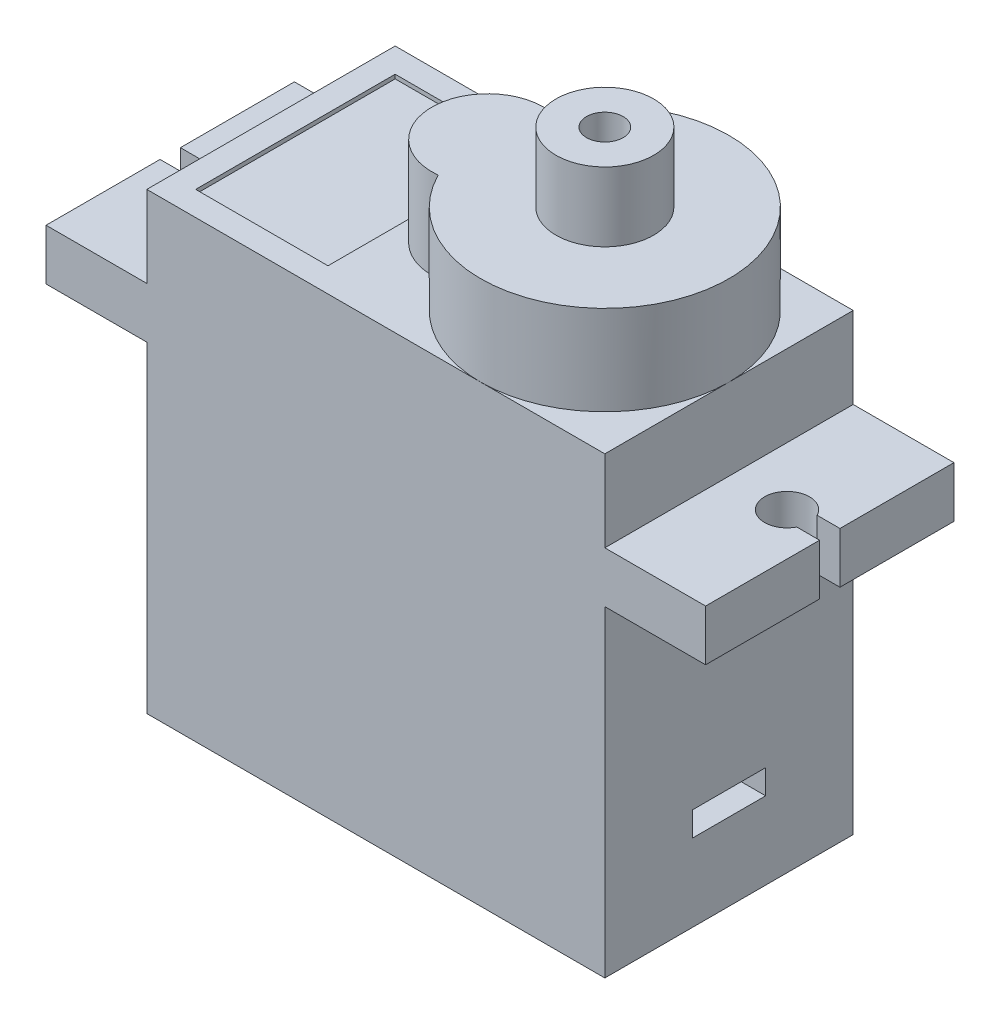
ISO-10303-21;
HEADER;
FILE_DESCRIPTION(('STEP AP214'),'2;1');
FILE_NAME('part.step','',(''),(''),'','','');
FILE_SCHEMA(('AUTOMOTIVE_DESIGN { 1 0 10303 214 1 1 1 1 }'));
ENDSEC;
DATA;
#1=APPLICATION_CONTEXT('core data for automotive mechanical design processes');
#2=APPLICATION_PROTOCOL_DEFINITION('international standard','automotive_design',2000,#1);
#3=PRODUCT_CONTEXT('',#1,'mechanical');
#4=PRODUCT('Part','Part','',(#3));
#5=PRODUCT_RELATED_PRODUCT_CATEGORY('part','',(#4));
#6=PRODUCT_DEFINITION_FORMATION('','',#4);
#7=PRODUCT_DEFINITION_CONTEXT('part definition',#1,'design');
#8=PRODUCT_DEFINITION('design','',#6,#7);
#9=PRODUCT_DEFINITION_SHAPE('','',#8);
#10=(LENGTH_UNIT() NAMED_UNIT(*) SI_UNIT(.MILLI.,.METRE.));
#11=(NAMED_UNIT(*) PLANE_ANGLE_UNIT() SI_UNIT($,.RADIAN.));
#12=(NAMED_UNIT(*) SI_UNIT($,.STERADIAN.) SOLID_ANGLE_UNIT());
#13=UNCERTAINTY_MEASURE_WITH_UNIT(LENGTH_MEASURE(1.E-05),#10,'distance_accuracy_value','');
#14=(GEOMETRIC_REPRESENTATION_CONTEXT(3) GLOBAL_UNCERTAINTY_ASSIGNED_CONTEXT((#13)) GLOBAL_UNIT_ASSIGNED_CONTEXT((#10,
#11,#12)) REPRESENTATION_CONTEXT('',''));
#15=CARTESIAN_POINT('',(0.,0.,0.));
#16=DIRECTION('',(0.,0.,1.));
#17=DIRECTION('',(1.,0.,0.));
#18=AXIS2_PLACEMENT_3D('',#15,#16,#17);
#19=CARTESIAN_POINT('',(16.2,15.8,12.2));
#20=DIRECTION('',(-1.,0.,0.));
#21=DIRECTION('',(0.,-1.,0.));
#22=AXIS2_PLACEMENT_3D('',#19,#20,#21);
#23=PLANE('',#22);
#24=DIRECTION('',(0.,1.,0.));
#25=VECTOR('',#24,1.);
#26=CARTESIAN_POINT('',(16.2,-0.00100000000002182,5.6));
#27=LINE('',#26,#25);
#28=CARTESIAN_POINT('',(16.2,15.8,5.6));
#29=VERTEX_POINT('',#28);
#30=CARTESIAN_POINT('',(16.2,18.3,5.6));
#31=VERTEX_POINT('',#30);
#32=EDGE_CURVE('E306',#29,#31,#27,.T.);
#33=ORIENTED_EDGE('',*,*,#32,.F.);
#34=DIRECTION('',(0.,0.,-1.));
#35=VECTOR('',#34,1.);
#36=CARTESIAN_POINT('',(16.2,15.8,12.2));
#37=LINE('',#36,#35);
#38=CARTESIAN_POINT('',(16.2,15.8,0.));
#39=VERTEX_POINT('',#38);
#40=EDGE_CURVE('E509',#29,#39,#37,.T.);
#41=ORIENTED_EDGE('',*,*,#40,.T.);
#42=DIRECTION('',(0.,1.,0.));
#43=VECTOR('',#42,1.);
#44=CARTESIAN_POINT('',(16.2,15.8,0.));
#45=LINE('',#44,#43);
#46=CARTESIAN_POINT('',(16.2,18.3,0.));
#47=VERTEX_POINT('',#46);
#48=EDGE_CURVE('E463',#39,#47,#45,.T.);
#49=ORIENTED_EDGE('',*,*,#48,.T.);
#50=DIRECTION('',(0.,0.,-1.));
#51=VECTOR('',#50,1.);
#52=CARTESIAN_POINT('',(16.2,18.3,12.2));
#53=LINE('',#52,#51);
#54=EDGE_CURVE('E507',#31,#47,#53,.T.);
#55=ORIENTED_EDGE('',*,*,#54,.F.);
#56=EDGE_LOOP('',(#33,#41,#49,#55));
#57=FACE_BOUND('',#56,.T.);
#58=ADVANCED_FACE('F68',(#57),#23,.F.);
#59=CARTESIAN_POINT('',(-11.25,18.3,12.2));
#60=DIRECTION('',(0.,-1.,0.));
#61=DIRECTION('',(1.,0.,0.));
#62=AXIS2_PLACEMENT_3D('',#59,#60,#61);
#63=PLANE('',#62);
#64=DIRECTION('',(-1.,0.,0.));
#65=VECTOR('',#64,1.);
#66=CARTESIAN_POINT('',(0.,18.3,6.6));
#67=LINE('',#66,#65);
#68=CARTESIAN_POINT('',(-15.0797958971133,18.3,6.6));
#69=VERTEX_POINT('',#68);
#70=CARTESIAN_POINT('',(-16.2,18.3,6.6));
#71=VERTEX_POINT('',#70);
#72=EDGE_CURVE('E317',#69,#71,#67,.T.);
#73=ORIENTED_EDGE('',*,*,#72,.T.);
#74=DIRECTION('',(0.,0.,-1.));
#75=VECTOR('',#74,1.);
#76=CARTESIAN_POINT('',(-16.2,18.3,12.2));
#77=LINE('',#76,#75);
#78=CARTESIAN_POINT('',(-16.2,18.3,12.2));
#79=VERTEX_POINT('',#78);
#80=EDGE_CURVE('E491',#79,#71,#77,.T.);
#81=ORIENTED_EDGE('',*,*,#80,.F.);
#82=DIRECTION('',(-1.,0.,0.));
#83=VECTOR('',#82,1.);
#84=CARTESIAN_POINT('',(-11.25,18.3,12.2));
#85=LINE('',#84,#83);
#86=CARTESIAN_POINT('',(-11.25,18.3,12.2));
#87=VERTEX_POINT('',#86);
#88=EDGE_CURVE('E447',#87,#79,#85,.T.);
#89=ORIENTED_EDGE('',*,*,#88,.F.);
#90=DIRECTION('',(0.,0.,-1.));
#91=VECTOR('',#90,1.);
#92=CARTESIAN_POINT('',(-11.25,18.3,12.2));
#93=LINE('',#92,#91);
#94=CARTESIAN_POINT('',(-11.25,18.3,0.));
#95=VERTEX_POINT('',#94);
#96=EDGE_CURVE('E494',#87,#95,#93,.T.);
#97=ORIENTED_EDGE('',*,*,#96,.T.);
#98=DIRECTION('',(-1.,0.,0.));
#99=VECTOR('',#98,1.);
#100=CARTESIAN_POINT('',(-11.25,18.3,0.));
#101=LINE('',#100,#99);
#102=CARTESIAN_POINT('',(-16.2,18.3,0.));
#103=VERTEX_POINT('',#102);
#104=EDGE_CURVE('E477',#95,#103,#101,.T.);
#105=ORIENTED_EDGE('',*,*,#104,.T.);
#106=CARTESIAN_POINT('',(-16.2,18.3,5.6));
#107=VERTEX_POINT('',#106);
#108=EDGE_CURVE('E490',#107,#103,#77,.T.);
#109=ORIENTED_EDGE('',*,*,#108,.F.);
#110=DIRECTION('',(-1.,0.,0.));
#111=VECTOR('',#110,1.);
#112=CARTESIAN_POINT('',(0.,18.3,5.60000000000001));
#113=LINE('',#112,#111);
#114=CARTESIAN_POINT('',(-15.0797958971133,18.3,5.6));
#115=VERTEX_POINT('',#114);
#116=EDGE_CURVE('E314',#115,#107,#113,.T.);
#117=ORIENTED_EDGE('',*,*,#116,.F.);
#118=CARTESIAN_POINT('',(-14.1,18.3,6.1));
#119=DIRECTION('',(0.,1.,0.));
#120=DIRECTION('',(-1.,0.,0.));
#121=AXIS2_PLACEMENT_3D('',#118,#119,#120);
#122=CIRCLE('',#121,1.1);
#123=EDGE_CURVE('E310',#69,#115,#122,.T.);
#124=ORIENTED_EDGE('',*,*,#123,.F.);
#125=EDGE_LOOP('',(#73,#81,#89,#97,#105,#109,#117,#124));
#126=FACE_BOUND('',#125,.T.);
#127=ADVANCED_FACE('F565',(#126),#63,.F.);
#128=CARTESIAN_POINT('',(-16.2,18.3,12.2));
#129=DIRECTION('',(1.,0.,0.));
#130=DIRECTION('',(0.,0.,-1.));
#131=AXIS2_PLACEMENT_3D('',#128,#129,#130);
#132=PLANE('',#131);
#133=DIRECTION('',(0.,1.,0.));
#134=VECTOR('',#133,1.);
#135=CARTESIAN_POINT('',(-16.2,-0.00100000000002182,6.6));
#136=LINE('',#135,#134);
#137=CARTESIAN_POINT('',(-16.2,15.8,6.6));
#138=VERTEX_POINT('',#137);
#139=EDGE_CURVE('E323',#138,#71,#136,.T.);
#140=ORIENTED_EDGE('',*,*,#139,.F.);
#141=DIRECTION('',(0.,0.,-1.));
#142=VECTOR('',#141,1.);
#143=CARTESIAN_POINT('',(-16.2,15.8,12.2));
#144=LINE('',#143,#142);
#145=CARTESIAN_POINT('',(-16.2,15.8,12.2));
#146=VERTEX_POINT('',#145);
#147=EDGE_CURVE('E487',#146,#138,#144,.T.);
#148=ORIENTED_EDGE('',*,*,#147,.F.);
#149=DIRECTION('',(0.,-1.,0.));
#150=VECTOR('',#149,1.);
#151=CARTESIAN_POINT('',(-16.2,18.3,12.2));
#152=LINE('',#151,#150);
#153=EDGE_CURVE('E449',#79,#146,#152,.T.);
#154=ORIENTED_EDGE('',*,*,#153,.F.);
#155=ORIENTED_EDGE('',*,*,#80,.T.);
#156=EDGE_LOOP('',(#140,#148,#154,#155));
#157=FACE_BOUND('',#156,.T.);
#158=ADVANCED_FACE('F570',(#157),#132,.F.);
#159=CARTESIAN_POINT('',(-16.2,15.8,12.2));
#160=DIRECTION('',(0.,1.,0.));
#161=DIRECTION('',(0.,0.,1.));
#162=AXIS2_PLACEMENT_3D('',#159,#160,#161);
#163=PLANE('',#162);
#164=DIRECTION('',(1.,0.,0.));
#165=VECTOR('',#164,1.);
#166=CARTESIAN_POINT('',(0.,15.8,6.6));
#167=LINE('',#166,#165);
#168=CARTESIAN_POINT('',(-15.0797958971133,15.8,6.6));
#169=VERTEX_POINT('',#168);
#170=EDGE_CURVE('E311',#138,#169,#167,.T.);
#171=ORIENTED_EDGE('',*,*,#170,.T.);
#172=CARTESIAN_POINT('',(-14.1,15.8,6.1));
#173=DIRECTION('',(0.,1.,0.));
#174=DIRECTION('',(0.,0.,1.));
#175=AXIS2_PLACEMENT_3D('',#172,#173,#174);
#176=CIRCLE('',#175,1.1);
#177=CARTESIAN_POINT('',(-15.0797958971133,15.8,5.59999999999999));
#178=VERTEX_POINT('',#177);
#179=EDGE_CURVE('E315',#178,#169,#176,.F.);
#180=ORIENTED_EDGE('',*,*,#179,.F.);
#181=DIRECTION('',(1.,0.,0.));
#182=VECTOR('',#181,1.);
#183=CARTESIAN_POINT('',(0.,15.8,5.60000000000001));
#184=LINE('',#183,#182);
#185=CARTESIAN_POINT('',(-16.2,15.8,5.6));
#186=VERTEX_POINT('',#185);
#187=EDGE_CURVE('E91',#186,#178,#184,.T.);
#188=ORIENTED_EDGE('',*,*,#187,.F.);
#189=CARTESIAN_POINT('',(-16.2,15.8,0.));
#190=VERTEX_POINT('',#189);
#191=EDGE_CURVE('E486',#186,#190,#144,.T.);
#192=ORIENTED_EDGE('',*,*,#191,.T.);
#193=DIRECTION('',(1.,0.,0.));
#194=VECTOR('',#193,1.);
#195=CARTESIAN_POINT('',(-16.2,15.8,0.));
#196=LINE('',#195,#194);
#197=CARTESIAN_POINT('',(-11.25,15.8,0.));
#198=VERTEX_POINT('',#197);
#199=EDGE_CURVE('E429',#190,#198,#196,.T.);
#200=ORIENTED_EDGE('',*,*,#199,.T.);
#201=DIRECTION('',(0.,0.,-1.));
#202=VECTOR('',#201,1.);
#203=CARTESIAN_POINT('',(-11.25,15.8,12.2));
#204=LINE('',#203,#202);
#205=CARTESIAN_POINT('',(-11.25,15.8,12.2));
#206=VERTEX_POINT('',#205);
#207=EDGE_CURVE('E453',#206,#198,#204,.T.);
#208=ORIENTED_EDGE('',*,*,#207,.F.);
#209=DIRECTION('',(1.,0.,0.));
#210=VECTOR('',#209,1.);
#211=CARTESIAN_POINT('',(-16.2,15.8,12.2));
#212=LINE('',#211,#210);
#213=EDGE_CURVE('E451',#146,#206,#212,.T.);
#214=ORIENTED_EDGE('',*,*,#213,.F.);
#215=ORIENTED_EDGE('',*,*,#147,.T.);
#216=EDGE_LOOP('',(#171,#180,#188,#192,#200,#208,#214,#215));
#217=FACE_BOUND('',#216,.T.);
#218=ADVANCED_FACE('F574',(#217),#163,.F.);
#219=CARTESIAN_POINT('',(11.25,22.3,12.2));
#220=DIRECTION('',(0.,-1.,0.));
#221=DIRECTION('',(1.,0.,0.));
#222=AXIS2_PLACEMENT_3D('',#219,#220,#221);
#223=PLANE('',#222);
#224=CARTESIAN_POINT('',(-0.6,22.3,6.1));
#225=DIRECTION('',(0.,1.,0.));
#226=DIRECTION('',(-1.,0.,0.));
#227=AXIS2_PLACEMENT_3D('',#224,#225,#226);
#228=CIRCLE('',#227,2.75);
#229=CARTESIAN_POINT('',(-0.30304347826087,22.3,3.36608031862738));
#230=VERTEX_POINT('',#229);
#231=CARTESIAN_POINT('',(-0.30304347826087,22.3,8.83391968137262));
#232=VERTEX_POINT('',#231);
#233=EDGE_CURVE('E368',#230,#232,#228,.T.);
#234=ORIENTED_EDGE('',*,*,#233,.F.);
#235=CARTESIAN_POINT('',(5.15,22.3,6.1));
#236=DIRECTION('',(0.,1.,0.));
#237=DIRECTION('',(-1.,0.,0.));
#238=AXIS2_PLACEMENT_3D('',#235,#236,#237);
#239=CIRCLE('',#238,6.1);
#240=CARTESIAN_POINT('',(5.15,22.3,0.));
#241=VERTEX_POINT('',#240);
#242=EDGE_CURVE('E386',#241,#230,#239,.T.);
#243=ORIENTED_EDGE('',*,*,#242,.F.);
#244=DIRECTION('',(-1.,0.,0.));
#245=VECTOR('',#244,1.);
#246=CARTESIAN_POINT('',(11.25,22.3,0.));
#247=LINE('',#246,#245);
#248=CARTESIAN_POINT('',(-11.25,22.3,0.));
#249=VERTEX_POINT('',#248);
#250=EDGE_CURVE('E471',#241,#249,#247,.T.);
#251=ORIENTED_EDGE('',*,*,#250,.T.);
#252=DIRECTION('',(0.,0.,-1.));
#253=VECTOR('',#252,1.);
#254=CARTESIAN_POINT('',(-11.25,22.3,12.2));
#255=LINE('',#254,#253);
#256=CARTESIAN_POINT('',(-11.25,22.3,12.2));
#257=VERTEX_POINT('',#256);
#258=EDGE_CURVE('E497',#257,#249,#255,.T.);
#259=ORIENTED_EDGE('',*,*,#258,.F.);
#260=DIRECTION('',(-1.,0.,0.));
#261=VECTOR('',#260,1.);
#262=CARTESIAN_POINT('',(11.25,22.3,12.2));
#263=LINE('',#262,#261);
#264=CARTESIAN_POINT('',(5.15,22.3,12.2));
#265=VERTEX_POINT('',#264);
#266=EDGE_CURVE('E441',#265,#257,#263,.T.);
#267=ORIENTED_EDGE('',*,*,#266,.F.);
#268=EDGE_CURVE('E379',#232,#265,#239,.T.);
#269=ORIENTED_EDGE('',*,*,#268,.F.);
#270=EDGE_LOOP('',(#234,#243,#251,#259,#267,#269));
#271=FACE_BOUND('',#270,.T.);
#272=DIRECTION('',(0.,0.,1.));
#273=VECTOR('',#272,1.);
#274=CARTESIAN_POINT('',(-3.55,22.3,0.));
#275=LINE('',#274,#273);
#276=CARTESIAN_POINT('',(-3.55,22.3,1.2));
#277=VERTEX_POINT('',#276);
#278=CARTESIAN_POINT('',(-3.55,22.3,11.));
#279=VERTEX_POINT('',#278);
#280=EDGE_CURVE('E341',#277,#279,#275,.T.);
#281=ORIENTED_EDGE('',*,*,#280,.T.);
#282=DIRECTION('',(1.,0.,0.));
#283=VECTOR('',#282,1.);
#284=CARTESIAN_POINT('',(0.,22.3,11.));
#285=LINE('',#284,#283);
#286=CARTESIAN_POINT('',(-10.05,22.3,11.));
#287=VERTEX_POINT('',#286);
#288=EDGE_CURVE('E347',#287,#279,#285,.T.);
#289=ORIENTED_EDGE('',*,*,#288,.F.);
#290=DIRECTION('',(0.,0.,1.));
#291=VECTOR('',#290,1.);
#292=CARTESIAN_POINT('',(-10.05,22.3,0.));
#293=LINE('',#292,#291);
#294=CARTESIAN_POINT('',(-10.05,22.3,1.2));
#295=VERTEX_POINT('',#294);
#296=EDGE_CURVE('E361',#295,#287,#293,.T.);
#297=ORIENTED_EDGE('',*,*,#296,.F.);
#298=DIRECTION('',(1.,0.,0.));
#299=VECTOR('',#298,1.);
#300=CARTESIAN_POINT('',(0.,22.3,1.2));
#301=LINE('',#300,#299);
#302=EDGE_CURVE('E358',#295,#277,#301,.T.);
#303=ORIENTED_EDGE('',*,*,#302,.T.);
#304=EDGE_LOOP('',(#281,#289,#297,#303));
#305=FACE_BOUND('',#304,.T.);
#306=ADVANCED_FACE('F536',(#271,#305),#223,.F.);
#307=CARTESIAN_POINT('',(11.25,22.3,6.1));
#308=VERTEX_POINT('',#307);
#309=EDGE_CURVE('E76',#265,#308,#239,.T.);
#310=ORIENTED_EDGE('',*,*,#309,.F.);
#311=CARTESIAN_POINT('',(11.25,22.3,12.2));
#312=VERTEX_POINT('',#311);
#313=EDGE_CURVE('E442',#312,#265,#263,.T.);
#314=ORIENTED_EDGE('',*,*,#313,.F.);
#315=DIRECTION('',(0.,0.,-1.));
#316=VECTOR('',#315,1.);
#317=CARTESIAN_POINT('',(11.25,22.3,12.2));
#318=LINE('',#317,#316);
#319=EDGE_CURVE('E501',#312,#308,#318,.T.);
#320=ORIENTED_EDGE('',*,*,#319,.T.);
#321=EDGE_LOOP('',(#310,#314,#320));
#322=FACE_BOUND('',#321,.T.);
#323=ADVANCED_FACE('F532',(#322),#223,.F.);
#324=CARTESIAN_POINT('',(-11.25,15.8,12.2));
#325=DIRECTION('',(1.,0.,0.));
#326=DIRECTION('',(0.,1.,0.));
#327=AXIS2_PLACEMENT_3D('',#324,#325,#326);
#328=PLANE('',#327);
#329=DIRECTION('',(0.,-1.,0.));
#330=VECTOR('',#329,1.);
#331=CARTESIAN_POINT('',(-11.25,15.8,0.));
#332=LINE('',#331,#330);
#333=CARTESIAN_POINT('',(-11.25,0.,0.));
#334=VERTEX_POINT('',#333);
#335=EDGE_CURVE('E418',#198,#334,#332,.T.);
#336=ORIENTED_EDGE('',*,*,#335,.T.);
#337=DIRECTION('',(0.,0.,-1.));
#338=VECTOR('',#337,1.);
#339=CARTESIAN_POINT('',(-11.25,0.,12.2));
#340=LINE('',#339,#338);
#341=CARTESIAN_POINT('',(-11.25,0.,12.2));
#342=VERTEX_POINT('',#341);
#343=EDGE_CURVE('E518',#342,#334,#340,.T.);
#344=ORIENTED_EDGE('',*,*,#343,.F.);
#345=DIRECTION('',(0.,-1.,0.));
#346=VECTOR('',#345,1.);
#347=CARTESIAN_POINT('',(-11.25,15.8,12.2));
#348=LINE('',#347,#346);
#349=EDGE_CURVE('E425',#206,#342,#348,.T.);
#350=ORIENTED_EDGE('',*,*,#349,.F.);
#351=ORIENTED_EDGE('',*,*,#207,.T.);
#352=EDGE_LOOP('',(#336,#344,#350,#351));
#353=FACE_BOUND('',#352,.T.);
#354=ADVANCED_FACE('F70',(#353),#328,.F.);
#355=CARTESIAN_POINT('',(-11.25,0.,12.2));
#356=DIRECTION('',(0.,1.,0.));
#357=DIRECTION('',(-1.,0.,0.));
#358=AXIS2_PLACEMENT_3D('',#355,#356,#357);
#359=PLANE('',#358);
#360=DIRECTION('',(1.,0.,0.));
#361=VECTOR('',#360,1.);
#362=CARTESIAN_POINT('',(-11.25,0.,0.));
#363=LINE('',#362,#361);
#364=CARTESIAN_POINT('',(11.25,0.,0.));
#365=VERTEX_POINT('',#364);
#366=EDGE_CURVE('E456',#334,#365,#363,.T.);
#367=ORIENTED_EDGE('',*,*,#366,.T.);
#368=DIRECTION('',(0.,0.,-1.));
#369=VECTOR('',#368,1.);
#370=CARTESIAN_POINT('',(11.25,0.,12.2));
#371=LINE('',#370,#369);
#372=CARTESIAN_POINT('',(11.25,0.,12.2));
#373=VERTEX_POINT('',#372);
#374=EDGE_CURVE('E516',#373,#365,#371,.T.);
#375=ORIENTED_EDGE('',*,*,#374,.F.);
#376=DIRECTION('',(1.,0.,0.));
#377=VECTOR('',#376,1.);
#378=CARTESIAN_POINT('',(-11.25,0.,12.2));
#379=LINE('',#378,#377);
#380=EDGE_CURVE('E428',#342,#373,#379,.T.);
#381=ORIENTED_EDGE('',*,*,#380,.F.);
#382=ORIENTED_EDGE('',*,*,#343,.T.);
#383=EDGE_LOOP('',(#367,#375,#381,#382));
#384=FACE_BOUND('',#383,.T.);
#385=ADVANCED_FACE('F582',(#384),#359,.F.);
#386=CARTESIAN_POINT('',(11.25,0.,12.2));
#387=DIRECTION('',(-1.,0.,0.));
#388=DIRECTION('',(0.,-1.,0.));
#389=AXIS2_PLACEMENT_3D('',#386,#387,#388);
#390=PLANE('',#389);
#391=DIRECTION('',(0.,0.,-1.));
#392=VECTOR('',#391,1.);
#393=CARTESIAN_POINT('',(11.25,3.8,7.9));
#394=LINE('',#393,#392);
#395=CARTESIAN_POINT('',(11.25,3.8,7.9));
#396=VERTEX_POINT('',#395);
#397=CARTESIAN_POINT('',(11.25,3.8,4.3));
#398=VERTEX_POINT('',#397);
#399=EDGE_CURVE('E408',#396,#398,#394,.T.);
#400=ORIENTED_EDGE('',*,*,#399,.F.);
#401=DIRECTION('',(0.,-1.,0.));
#402=VECTOR('',#401,1.);
#403=CARTESIAN_POINT('',(11.25,5.,7.9));
#404=LINE('',#403,#402);
#405=CARTESIAN_POINT('',(11.25,5.,7.9));
#406=VERTEX_POINT('',#405);
#407=EDGE_CURVE('E392',#406,#396,#404,.T.);
#408=ORIENTED_EDGE('',*,*,#407,.F.);
#409=DIRECTION('',(0.,0.,1.));
#410=VECTOR('',#409,1.);
#411=CARTESIAN_POINT('',(11.25,5.,7.9));
#412=LINE('',#411,#410);
#413=CARTESIAN_POINT('',(11.25,5.00000000000001,4.3));
#414=VERTEX_POINT('',#413);
#415=EDGE_CURVE('E397',#414,#406,#412,.T.);
#416=ORIENTED_EDGE('',*,*,#415,.F.);
#417=DIRECTION('',(0.,1.,0.));
#418=VECTOR('',#417,1.);
#419=CARTESIAN_POINT('',(11.25,5.00000000000001,4.3));
#420=LINE('',#419,#418);
#421=EDGE_CURVE('E411',#398,#414,#420,.T.);
#422=ORIENTED_EDGE('',*,*,#421,.F.);
#423=EDGE_LOOP('',(#400,#408,#416,#422));
#424=FACE_BOUND('',#423,.T.);
#425=DIRECTION('',(0.,1.,0.));
#426=VECTOR('',#425,1.);
#427=CARTESIAN_POINT('',(11.25,0.,0.));
#428=LINE('',#427,#426);
#429=CARTESIAN_POINT('',(11.25,15.8,0.));
#430=VERTEX_POINT('',#429);
#431=EDGE_CURVE('E458',#365,#430,#428,.T.);
#432=ORIENTED_EDGE('',*,*,#431,.T.);
#433=DIRECTION('',(0.,0.,-1.));
#434=VECTOR('',#433,1.);
#435=CARTESIAN_POINT('',(11.25,15.8,12.2));
#436=LINE('',#435,#434);
#437=CARTESIAN_POINT('',(11.25,15.8,12.2));
#438=VERTEX_POINT('',#437);
#439=EDGE_CURVE('E513',#438,#430,#436,.T.);
#440=ORIENTED_EDGE('',*,*,#439,.F.);
#441=DIRECTION('',(0.,1.,0.));
#442=VECTOR('',#441,1.);
#443=CARTESIAN_POINT('',(11.25,0.,12.2));
#444=LINE('',#443,#442);
#445=EDGE_CURVE('E431',#373,#438,#444,.T.);
#446=ORIENTED_EDGE('',*,*,#445,.F.);
#447=ORIENTED_EDGE('',*,*,#374,.T.);
#448=EDGE_LOOP('',(#432,#440,#446,#447));
#449=FACE_BOUND('',#448,.T.);
#450=ADVANCED_FACE('F585',(#424,#449),#390,.F.);
#451=CARTESIAN_POINT('',(11.25,15.8,12.2));
#452=DIRECTION('',(0.,1.,0.));
#453=DIRECTION('',(-1.,0.,0.));
#454=AXIS2_PLACEMENT_3D('',#451,#452,#453);
#455=PLANE('',#454);
#456=DIRECTION('',(-1.,0.,0.));
#457=VECTOR('',#456,1.);
#458=CARTESIAN_POINT('',(0.,15.8,5.60000000000001));
#459=LINE('',#458,#457);
#460=CARTESIAN_POINT('',(15.0797958971133,15.8,5.6));
#461=VERTEX_POINT('',#460);
#462=EDGE_CURVE('E291',#29,#461,#459,.T.);
#463=ORIENTED_EDGE('',*,*,#462,.T.);
#464=CARTESIAN_POINT('',(14.1,15.8,6.1));
#465=DIRECTION('',(0.,1.,0.));
#466=DIRECTION('',(-1.,0.,0.));
#467=AXIS2_PLACEMENT_3D('',#464,#465,#466);
#468=CIRCLE('',#467,1.1);
#469=CARTESIAN_POINT('',(15.0797958971133,15.8,6.6));
#470=VERTEX_POINT('',#469);
#471=EDGE_CURVE('E292',#461,#470,#468,.T.);
#472=ORIENTED_EDGE('',*,*,#471,.T.);
#473=DIRECTION('',(-1.,0.,0.));
#474=VECTOR('',#473,1.);
#475=CARTESIAN_POINT('',(0.,15.8,6.6));
#476=LINE('',#475,#474);
#477=CARTESIAN_POINT('',(16.2,15.8,6.6));
#478=VERTEX_POINT('',#477);
#479=EDGE_CURVE('E281',#478,#470,#476,.T.);
#480=ORIENTED_EDGE('',*,*,#479,.F.);
#481=CARTESIAN_POINT('',(16.2,15.8,12.2));
#482=VERTEX_POINT('',#481);
#483=EDGE_CURVE('E510',#482,#478,#37,.T.);
#484=ORIENTED_EDGE('',*,*,#483,.F.);
#485=DIRECTION('',(1.,0.,0.));
#486=VECTOR('',#485,1.);
#487=CARTESIAN_POINT('',(11.25,15.8,12.2));
#488=LINE('',#487,#486);
#489=EDGE_CURVE('E433',#438,#482,#488,.T.);
#490=ORIENTED_EDGE('',*,*,#489,.F.);
#491=ORIENTED_EDGE('',*,*,#439,.T.);
#492=DIRECTION('',(1.,0.,0.));
#493=VECTOR('',#492,1.);
#494=CARTESIAN_POINT('',(11.25,15.8,0.));
#495=LINE('',#494,#493);
#496=EDGE_CURVE('E460',#430,#39,#495,.T.);
#497=ORIENTED_EDGE('',*,*,#496,.T.);
#498=ORIENTED_EDGE('',*,*,#40,.F.);
#499=EDGE_LOOP('',(#463,#472,#480,#484,#490,#491,#497,#498));
#500=FACE_BOUND('',#499,.T.);
#501=ADVANCED_FACE('F591',(#500),#455,.F.);
#502=ORIENTED_EDGE('',*,*,#483,.T.);
#503=DIRECTION('',(0.,1.,0.));
#504=VECTOR('',#503,1.);
#505=CARTESIAN_POINT('',(16.2,-0.00100000000002182,6.6));
#506=LINE('',#505,#504);
#507=CARTESIAN_POINT('',(16.2,18.3,6.6));
#508=VERTEX_POINT('',#507);
#509=EDGE_CURVE('E284',#478,#508,#506,.T.);
#510=ORIENTED_EDGE('',*,*,#509,.T.);
#511=CARTESIAN_POINT('',(16.2,18.3,12.2));
#512=VERTEX_POINT('',#511);
#513=EDGE_CURVE('E298',#512,#508,#53,.T.);
#514=ORIENTED_EDGE('',*,*,#513,.F.);
#515=DIRECTION('',(0.,1.,0.));
#516=VECTOR('',#515,1.);
#517=CARTESIAN_POINT('',(16.2,15.8,12.2));
#518=LINE('',#517,#516);
#519=EDGE_CURVE('E435',#482,#512,#518,.T.);
#520=ORIENTED_EDGE('',*,*,#519,.F.);
#521=EDGE_LOOP('',(#502,#510,#514,#520));
#522=FACE_BOUND('',#521,.T.);
#523=ADVANCED_FACE('F593',(#522),#23,.F.);
#524=CARTESIAN_POINT('',(16.2,18.3,12.2));
#525=DIRECTION('',(0.,-1.,0.));
#526=DIRECTION('',(0.,0.,-1.));
#527=AXIS2_PLACEMENT_3D('',#524,#525,#526);
#528=PLANE('',#527);
#529=DIRECTION('',(1.,0.,0.));
#530=VECTOR('',#529,1.);
#531=CARTESIAN_POINT('',(0.,18.3,5.60000000000001));
#532=LINE('',#531,#530);
#533=CARTESIAN_POINT('',(15.0797958971133,18.3,5.6));
#534=VERTEX_POINT('',#533);
#535=EDGE_CURVE('E83',#534,#31,#532,.T.);
#536=ORIENTED_EDGE('',*,*,#535,.T.);
#537=ORIENTED_EDGE('',*,*,#54,.T.);
#538=DIRECTION('',(-1.,0.,0.));
#539=VECTOR('',#538,1.);
#540=CARTESIAN_POINT('',(16.2,18.3,0.));
#541=LINE('',#540,#539);
#542=CARTESIAN_POINT('',(11.25,18.3,0.));
#543=VERTEX_POINT('',#542);
#544=EDGE_CURVE('E466',#47,#543,#541,.T.);
#545=ORIENTED_EDGE('',*,*,#544,.T.);
#546=DIRECTION('',(0.,0.,-1.));
#547=VECTOR('',#546,1.);
#548=CARTESIAN_POINT('',(11.25,18.3,12.2));
#549=LINE('',#548,#547);
#550=CARTESIAN_POINT('',(11.25,18.3,12.2));
#551=VERTEX_POINT('',#550);
#552=EDGE_CURVE('E504',#551,#543,#549,.T.);
#553=ORIENTED_EDGE('',*,*,#552,.F.);
#554=DIRECTION('',(-1.,0.,0.));
#555=VECTOR('',#554,1.);
#556=CARTESIAN_POINT('',(16.2,18.3,12.2));
#557=LINE('',#556,#555);
#558=EDGE_CURVE('E437',#512,#551,#557,.T.);
#559=ORIENTED_EDGE('',*,*,#558,.F.);
#560=ORIENTED_EDGE('',*,*,#513,.T.);
#561=DIRECTION('',(1.,0.,0.));
#562=VECTOR('',#561,1.);
#563=CARTESIAN_POINT('',(0.,18.3,6.6));
#564=LINE('',#563,#562);
#565=CARTESIAN_POINT('',(15.0797958971133,18.3,6.6));
#566=VERTEX_POINT('',#565);
#567=EDGE_CURVE('E278',#566,#508,#564,.T.);
#568=ORIENTED_EDGE('',*,*,#567,.F.);
#569=CARTESIAN_POINT('',(14.1,18.3,6.1));
#570=DIRECTION('',(0.,-1.,0.));
#571=DIRECTION('',(1.,0.,0.));
#572=AXIS2_PLACEMENT_3D('',#569,#570,#571);
#573=CIRCLE('',#572,1.1);
#574=EDGE_CURVE('E287',#566,#534,#573,.T.);
#575=ORIENTED_EDGE('',*,*,#574,.T.);
#576=EDGE_LOOP('',(#536,#537,#545,#553,#559,#560,#568,#575));
#577=FACE_BOUND('',#576,.T.);
#578=ADVANCED_FACE('F295',(#577),#528,.F.);
#579=CARTESIAN_POINT('',(11.25,18.3,12.2));
#580=DIRECTION('',(-1.,0.,0.));
#581=DIRECTION('',(0.,0.,1.));
#582=AXIS2_PLACEMENT_3D('',#579,#580,#581);
#583=PLANE('',#582);
#584=DIRECTION('',(0.,1.,0.));
#585=VECTOR('',#584,1.);
#586=CARTESIAN_POINT('',(11.25,18.3,0.));
#587=LINE('',#586,#585);
#588=CARTESIAN_POINT('',(11.25,22.3,0.));
#589=VERTEX_POINT('',#588);
#590=EDGE_CURVE('E468',#543,#589,#587,.T.);
#591=ORIENTED_EDGE('',*,*,#590,.T.);
#592=EDGE_CURVE('E500',#308,#589,#318,.T.);
#593=ORIENTED_EDGE('',*,*,#592,.F.);
#594=ORIENTED_EDGE('',*,*,#319,.F.);
#595=DIRECTION('',(0.,1.,0.));
#596=VECTOR('',#595,1.);
#597=CARTESIAN_POINT('',(11.25,18.3,12.2));
#598=LINE('',#597,#596);
#599=EDGE_CURVE('E439',#551,#312,#598,.T.);
#600=ORIENTED_EDGE('',*,*,#599,.F.);
#601=ORIENTED_EDGE('',*,*,#552,.T.);
#602=EDGE_LOOP('',(#591,#593,#594,#600,#601));
#603=FACE_BOUND('',#602,.T.);
#604=ADVANCED_FACE('F545',(#603),#583,.F.);
#605=EDGE_CURVE('E523',#308,#241,#239,.T.);
#606=ORIENTED_EDGE('',*,*,#605,.F.);
#607=ORIENTED_EDGE('',*,*,#592,.T.);
#608=EDGE_CURVE('E472',#589,#241,#247,.T.);
#609=ORIENTED_EDGE('',*,*,#608,.T.);
#610=EDGE_LOOP('',(#606,#607,#609));
#611=FACE_BOUND('',#610,.T.);
#612=ADVANCED_FACE('F549',(#611),#223,.F.);
#613=CARTESIAN_POINT('',(-11.25,22.3,12.2));
#614=DIRECTION('',(1.,0.,0.));
#615=DIRECTION('',(0.,0.,-1.));
#616=AXIS2_PLACEMENT_3D('',#613,#614,#615);
#617=PLANE('',#616);
#618=DIRECTION('',(0.,-1.,0.));
#619=VECTOR('',#618,1.);
#620=CARTESIAN_POINT('',(-11.25,22.3,0.));
#621=LINE('',#620,#619);
#622=EDGE_CURVE('E475',#249,#95,#621,.T.);
#623=ORIENTED_EDGE('',*,*,#622,.T.);
#624=ORIENTED_EDGE('',*,*,#96,.F.);
#625=DIRECTION('',(0.,-1.,0.));
#626=VECTOR('',#625,1.);
#627=CARTESIAN_POINT('',(-11.25,22.3,12.2));
#628=LINE('',#627,#626);
#629=EDGE_CURVE('E445',#257,#87,#628,.T.);
#630=ORIENTED_EDGE('',*,*,#629,.F.);
#631=ORIENTED_EDGE('',*,*,#258,.T.);
#632=EDGE_LOOP('',(#623,#624,#630,#631));
#633=FACE_BOUND('',#632,.T.);
#634=ADVANCED_FACE('F558',(#633),#617,.F.);
#635=ORIENTED_EDGE('',*,*,#191,.F.);
#636=DIRECTION('',(0.,1.,0.));
#637=VECTOR('',#636,1.);
#638=CARTESIAN_POINT('',(-16.2,-0.00100000000002182,5.6));
#639=LINE('',#638,#637);
#640=EDGE_CURVE('E325',#186,#107,#639,.T.);
#641=ORIENTED_EDGE('',*,*,#640,.T.);
#642=ORIENTED_EDGE('',*,*,#108,.T.);
#643=DIRECTION('',(0.,-1.,0.));
#644=VECTOR('',#643,1.);
#645=CARTESIAN_POINT('',(-16.2,18.3,0.));
#646=LINE('',#645,#644);
#647=EDGE_CURVE('E480',#103,#190,#646,.T.);
#648=ORIENTED_EDGE('',*,*,#647,.T.);
#649=EDGE_LOOP('',(#635,#641,#642,#648));
#650=FACE_BOUND('',#649,.T.);
#651=ADVANCED_FACE('F652',(#650),#132,.F.);
#652=CARTESIAN_POINT('',(0.,0.,12.2));
#653=DIRECTION('',(0.,0.,1.));
#654=DIRECTION('',(1.,0.,0.));
#655=AXIS2_PLACEMENT_3D('',#652,#653,#654);
#656=PLANE('',#655);
#657=ORIENTED_EDGE('',*,*,#349,.T.);
#658=ORIENTED_EDGE('',*,*,#380,.T.);
#659=ORIENTED_EDGE('',*,*,#445,.T.);
#660=ORIENTED_EDGE('',*,*,#489,.T.);
#661=ORIENTED_EDGE('',*,*,#519,.T.);
#662=ORIENTED_EDGE('',*,*,#558,.T.);
#663=ORIENTED_EDGE('',*,*,#599,.T.);
#664=ORIENTED_EDGE('',*,*,#313,.T.);
#665=ORIENTED_EDGE('',*,*,#266,.T.);
#666=ORIENTED_EDGE('',*,*,#629,.T.);
#667=ORIENTED_EDGE('',*,*,#88,.T.);
#668=ORIENTED_EDGE('',*,*,#153,.T.);
#669=ORIENTED_EDGE('',*,*,#213,.T.);
#670=EDGE_LOOP('',(#657,#658,#659,#660,#661,#662,#663,#664,#665,#666,#667,#668,#669));
#671=FACE_BOUND('',#670,.T.);
#672=ADVANCED_FACE('F540',(#671),#656,.T.);
#673=CARTESIAN_POINT('',(0.,0.,0.));
#674=DIRECTION('',(0.,0.,1.));
#675=DIRECTION('',(1.,0.,0.));
#676=AXIS2_PLACEMENT_3D('',#673,#674,#675);
#677=PLANE('',#676);
#678=ORIENTED_EDGE('',*,*,#335,.F.);
#679=ORIENTED_EDGE('',*,*,#199,.F.);
#680=ORIENTED_EDGE('',*,*,#647,.F.);
#681=ORIENTED_EDGE('',*,*,#104,.F.);
#682=ORIENTED_EDGE('',*,*,#622,.F.);
#683=ORIENTED_EDGE('',*,*,#250,.F.);
#684=ORIENTED_EDGE('',*,*,#608,.F.);
#685=ORIENTED_EDGE('',*,*,#590,.F.);
#686=ORIENTED_EDGE('',*,*,#544,.F.);
#687=ORIENTED_EDGE('',*,*,#48,.F.);
#688=ORIENTED_EDGE('',*,*,#496,.F.);
#689=ORIENTED_EDGE('',*,*,#431,.F.);
#690=ORIENTED_EDGE('',*,*,#366,.F.);
#691=EDGE_LOOP('',(#678,#679,#680,#681,#682,#683,#684,#685,#686,#687,#688,#689,#690));
#692=FACE_BOUND('',#691,.T.);
#693=ADVANCED_FACE('F553',(#692),#677,.F.);
#694=CARTESIAN_POINT('',(9.25,5.,7.9));
#695=DIRECTION('',(0.,0.,1.));
#696=DIRECTION('',(1.,0.,0.));
#697=AXIS2_PLACEMENT_3D('',#694,#695,#696);
#698=PLANE('',#697);
#699=ORIENTED_EDGE('',*,*,#407,.T.);
#700=DIRECTION('',(1.,0.,0.));
#701=VECTOR('',#700,1.);
#702=CARTESIAN_POINT('',(9.25,3.8,7.9));
#703=LINE('',#702,#701);
#704=CARTESIAN_POINT('',(9.25,3.8,7.9));
#705=VERTEX_POINT('',#704);
#706=EDGE_CURVE('E406',#705,#396,#703,.T.);
#707=ORIENTED_EDGE('',*,*,#706,.F.);
#708=DIRECTION('',(0.,-1.,0.));
#709=VECTOR('',#708,1.);
#710=CARTESIAN_POINT('',(9.25,5.,7.9));
#711=LINE('',#710,#709);
#712=CARTESIAN_POINT('',(9.25,5.,7.9));
#713=VERTEX_POINT('',#712);
#714=EDGE_CURVE('E393',#713,#705,#711,.T.);
#715=ORIENTED_EDGE('',*,*,#714,.F.);
#716=DIRECTION('',(1.,0.,0.));
#717=VECTOR('',#716,1.);
#718=CARTESIAN_POINT('',(9.25,5.,7.9));
#719=LINE('',#718,#717);
#720=EDGE_CURVE('E416',#713,#406,#719,.T.);
#721=ORIENTED_EDGE('',*,*,#720,.T.);
#722=EDGE_LOOP('',(#699,#707,#715,#721));
#723=FACE_BOUND('',#722,.T.);
#724=ADVANCED_FACE('F861',(#723),#698,.F.);
#725=CARTESIAN_POINT('',(9.25,5.,7.9));
#726=DIRECTION('',(0.,1.,0.));
#727=DIRECTION('',(-1.,0.,0.));
#728=AXIS2_PLACEMENT_3D('',#725,#726,#727);
#729=PLANE('',#728);
#730=ORIENTED_EDGE('',*,*,#415,.T.);
#731=ORIENTED_EDGE('',*,*,#720,.F.);
#732=DIRECTION('',(0.,0.,1.));
#733=VECTOR('',#732,1.);
#734=CARTESIAN_POINT('',(9.25,5.,7.9));
#735=LINE('',#734,#733);
#736=CARTESIAN_POINT('',(9.25,5.,4.3));
#737=VERTEX_POINT('',#736);
#738=EDGE_CURVE('E403',#737,#713,#735,.T.);
#739=ORIENTED_EDGE('',*,*,#738,.F.);
#740=DIRECTION('',(1.,0.,0.));
#741=VECTOR('',#740,1.);
#742=CARTESIAN_POINT('',(9.25,5.,4.3));
#743=LINE('',#742,#741);
#744=EDGE_CURVE('E419',#737,#414,#743,.T.);
#745=ORIENTED_EDGE('',*,*,#744,.T.);
#746=EDGE_LOOP('',(#730,#731,#739,#745));
#747=FACE_BOUND('',#746,.T.);
#748=ADVANCED_FACE('F853',(#747),#729,.F.);
#749=CARTESIAN_POINT('',(9.25,5.,4.3));
#750=DIRECTION('',(0.,0.,-1.));
#751=DIRECTION('',(0.,1.,0.));
#752=AXIS2_PLACEMENT_3D('',#749,#750,#751);
#753=PLANE('',#752);
#754=ORIENTED_EDGE('',*,*,#421,.T.);
#755=ORIENTED_EDGE('',*,*,#744,.F.);
#756=DIRECTION('',(0.,1.,0.));
#757=VECTOR('',#756,1.);
#758=CARTESIAN_POINT('',(9.25,5.,4.3));
#759=LINE('',#758,#757);
#760=CARTESIAN_POINT('',(9.25,3.8,4.3));
#761=VERTEX_POINT('',#760);
#762=EDGE_CURVE('E400',#761,#737,#759,.T.);
#763=ORIENTED_EDGE('',*,*,#762,.F.);
#764=DIRECTION('',(1.,0.,0.));
#765=VECTOR('',#764,1.);
#766=CARTESIAN_POINT('',(9.25,3.8,4.3));
#767=LINE('',#766,#765);
#768=EDGE_CURVE('E421',#761,#398,#767,.T.);
#769=ORIENTED_EDGE('',*,*,#768,.T.);
#770=EDGE_LOOP('',(#754,#755,#763,#769));
#771=FACE_BOUND('',#770,.T.);
#772=ADVANCED_FACE('F845',(#771),#753,.F.);
#773=CARTESIAN_POINT('',(9.25,3.8,7.9));
#774=DIRECTION('',(0.,-1.,0.));
#775=DIRECTION('',(1.,0.,0.));
#776=AXIS2_PLACEMENT_3D('',#773,#774,#775);
#777=PLANE('',#776);
#778=ORIENTED_EDGE('',*,*,#399,.T.);
#779=ORIENTED_EDGE('',*,*,#768,.F.);
#780=DIRECTION('',(0.,0.,-1.));
#781=VECTOR('',#780,1.);
#782=CARTESIAN_POINT('',(9.25,3.8,7.9));
#783=LINE('',#782,#781);
#784=EDGE_CURVE('E396',#705,#761,#783,.T.);
#785=ORIENTED_EDGE('',*,*,#784,.F.);
#786=ORIENTED_EDGE('',*,*,#706,.T.);
#787=EDGE_LOOP('',(#778,#779,#785,#786));
#788=FACE_BOUND('',#787,.T.);
#789=ADVANCED_FACE('F837',(#788),#777,.F.);
#790=CARTESIAN_POINT('',(9.25,0.,0.));
#791=DIRECTION('',(1.,0.,0.));
#792=DIRECTION('',(0.,0.,-1.));
#793=AXIS2_PLACEMENT_3D('',#790,#791,#792);
#794=PLANE('',#793);
#795=ORIENTED_EDGE('',*,*,#714,.T.);
#796=ORIENTED_EDGE('',*,*,#784,.T.);
#797=ORIENTED_EDGE('',*,*,#762,.T.);
#798=ORIENTED_EDGE('',*,*,#738,.T.);
#799=EDGE_LOOP('',(#795,#796,#797,#798));
#800=FACE_BOUND('',#799,.T.);
#801=ADVANCED_FACE('F828',(#800),#794,.T.);
#802=CARTESIAN_POINT('',(-0.600000000000001,26.7,6.1));
#803=DIRECTION('',(0.,-1.,0.));
#804=DIRECTION('',(1.,0.,0.));
#805=AXIS2_PLACEMENT_3D('',#802,#803,#804);
#806=CYLINDRICAL_SURFACE('',#805,2.75);
#807=ORIENTED_EDGE('',*,*,#233,.T.);
#808=DIRECTION('',(0.,-1.,0.));
#809=VECTOR('',#808,1.);
#810=CARTESIAN_POINT('',(-0.30304347826087,26.7,8.83391968137262));
#811=LINE('',#810,#809);
#812=CARTESIAN_POINT('',(-0.30304347826087,26.7,8.83391968137262));
#813=VERTEX_POINT('',#812);
#814=EDGE_CURVE('E389',#813,#232,#811,.T.);
#815=ORIENTED_EDGE('',*,*,#814,.F.);
#816=CARTESIAN_POINT('',(-0.600000000000001,26.7,6.1));
#817=DIRECTION('',(0.,1.,0.));
#818=DIRECTION('',(-1.,0.,0.));
#819=AXIS2_PLACEMENT_3D('',#816,#817,#818);
#820=CIRCLE('',#819,2.75);
#821=CARTESIAN_POINT('',(-0.30304347826087,26.7,3.36608031862738));
#822=VERTEX_POINT('',#821);
#823=EDGE_CURVE('E375',#822,#813,#820,.T.);
#824=ORIENTED_EDGE('',*,*,#823,.F.);
#825=DIRECTION('',(0.,-1.,0.));
#826=VECTOR('',#825,1.);
#827=CARTESIAN_POINT('',(-0.30304347826087,26.7,3.36608031862738));
#828=LINE('',#827,#826);
#829=EDGE_CURVE('E381',#822,#230,#828,.T.);
#830=ORIENTED_EDGE('',*,*,#829,.T.);
#831=EDGE_LOOP('',(#807,#815,#824,#830));
#832=FACE_BOUND('',#831,.T.);
#833=ADVANCED_FACE('F821',(#832),#806,.T.);
#834=CARTESIAN_POINT('',(5.15,26.7,6.1));
#835=DIRECTION('',(0.,-1.,0.));
#836=DIRECTION('',(1.,0.,0.));
#837=AXIS2_PLACEMENT_3D('',#834,#835,#836);
#838=CYLINDRICAL_SURFACE('',#837,6.1);
#839=ORIENTED_EDGE('',*,*,#268,.T.);
#840=ORIENTED_EDGE('',*,*,#309,.T.);
#841=ORIENTED_EDGE('',*,*,#605,.T.);
#842=ORIENTED_EDGE('',*,*,#242,.T.);
#843=ORIENTED_EDGE('',*,*,#829,.F.);
#844=CARTESIAN_POINT('',(5.15,26.7,6.1));
#845=DIRECTION('',(0.,1.,0.));
#846=DIRECTION('',(-1.,0.,0.));
#847=AXIS2_PLACEMENT_3D('',#844,#845,#846);
#848=CIRCLE('',#847,6.1);
#849=EDGE_CURVE('E378',#813,#822,#848,.T.);
#850=ORIENTED_EDGE('',*,*,#849,.F.);
#851=ORIENTED_EDGE('',*,*,#814,.T.);
#852=EDGE_LOOP('',(#839,#840,#841,#842,#843,#850,#851));
#853=FACE_BOUND('',#852,.T.);
#854=ADVANCED_FACE('F528',(#853),#838,.T.);
#855=CARTESIAN_POINT('',(0.,26.7,0.));
#856=DIRECTION('',(0.,1.,0.));
#857=DIRECTION('',(-1.,0.,0.));
#858=AXIS2_PLACEMENT_3D('',#855,#856,#857);
#859=PLANE('',#858);
#860=CARTESIAN_POINT('',(5.15,26.7,6.1));
#861=DIRECTION('',(0.,1.,0.));
#862=DIRECTION('',(-1.,0.,0.));
#863=AXIS2_PLACEMENT_3D('',#860,#861,#862);
#864=CIRCLE('',#863,2.4);
#865=CARTESIAN_POINT('',(2.75,26.7,6.1));
#866=VERTEX_POINT('',#865);
#867=EDGE_CURVE('E337',#866,#866,#864,.T.);
#868=ORIENTED_EDGE('',*,*,#867,.F.);
#869=EDGE_LOOP('',(#868));
#870=FACE_BOUND('',#869,.T.);
#871=ORIENTED_EDGE('',*,*,#823,.T.);
#872=ORIENTED_EDGE('',*,*,#849,.T.);
#873=EDGE_LOOP('',(#871,#872));
#874=FACE_BOUND('',#873,.T.);
#875=ADVANCED_FACE('F761',(#870,#874),#859,.T.);
#876=CARTESIAN_POINT('',(-3.55,22.1,0.));
#877=DIRECTION('',(-1.,0.,0.));
#878=DIRECTION('',(0.,0.,1.));
#879=AXIS2_PLACEMENT_3D('',#876,#877,#878);
#880=PLANE('',#879);
#881=ORIENTED_EDGE('',*,*,#280,.F.);
#882=DIRECTION('',(0.,1.,0.));
#883=VECTOR('',#882,1.);
#884=CARTESIAN_POINT('',(-3.55,22.1,1.2));
#885=LINE('',#884,#883);
#886=CARTESIAN_POINT('',(-3.55,22.1,1.2));
#887=VERTEX_POINT('',#886);
#888=EDGE_CURVE('E355',#887,#277,#885,.T.);
#889=ORIENTED_EDGE('',*,*,#888,.F.);
#890=DIRECTION('',(0.,0.,1.));
#891=VECTOR('',#890,1.);
#892=CARTESIAN_POINT('',(-3.55,22.1,0.));
#893=LINE('',#892,#891);
#894=CARTESIAN_POINT('',(-3.55,22.1,11.));
#895=VERTEX_POINT('',#894);
#896=EDGE_CURVE('E344',#887,#895,#893,.T.);
#897=ORIENTED_EDGE('',*,*,#896,.T.);
#898=DIRECTION('',(0.,1.,0.));
#899=VECTOR('',#898,1.);
#900=CARTESIAN_POINT('',(-3.55,22.1,11.));
#901=LINE('',#900,#899);
#902=EDGE_CURVE('E366',#895,#279,#901,.T.);
#903=ORIENTED_EDGE('',*,*,#902,.T.);
#904=EDGE_LOOP('',(#881,#889,#897,#903));
#905=FACE_BOUND('',#904,.T.);
#906=ADVANCED_FACE('F800',(#905),#880,.T.);
#907=CARTESIAN_POINT('',(0.,22.1,11.));
#908=DIRECTION('',(0.,0.,1.));
#909=DIRECTION('',(1.,0.,0.));
#910=AXIS2_PLACEMENT_3D('',#907,#908,#909);
#911=PLANE('',#910);
#912=ORIENTED_EDGE('',*,*,#288,.T.);
#913=ORIENTED_EDGE('',*,*,#902,.F.);
#914=DIRECTION('',(1.,0.,0.));
#915=VECTOR('',#914,1.);
#916=CARTESIAN_POINT('',(0.,22.1,11.));
#917=LINE('',#916,#915);
#918=CARTESIAN_POINT('',(-10.05,22.1,11.));
#919=VERTEX_POINT('',#918);
#920=EDGE_CURVE('E352',#919,#895,#917,.T.);
#921=ORIENTED_EDGE('',*,*,#920,.F.);
#922=DIRECTION('',(0.,1.,0.));
#923=VECTOR('',#922,1.);
#924=CARTESIAN_POINT('',(-10.05,22.1,11.));
#925=LINE('',#924,#923);
#926=EDGE_CURVE('E369',#919,#287,#925,.T.);
#927=ORIENTED_EDGE('',*,*,#926,.T.);
#928=EDGE_LOOP('',(#912,#913,#921,#927));
#929=FACE_BOUND('',#928,.T.);
#930=ADVANCED_FACE('F792',(#929),#911,.F.);
#931=CARTESIAN_POINT('',(-10.05,22.1,0.));
#932=DIRECTION('',(-1.,0.,0.));
#933=DIRECTION('',(0.,0.,1.));
#934=AXIS2_PLACEMENT_3D('',#931,#932,#933);
#935=PLANE('',#934);
#936=ORIENTED_EDGE('',*,*,#296,.T.);
#937=ORIENTED_EDGE('',*,*,#926,.F.);
#938=DIRECTION('',(0.,0.,1.));
#939=VECTOR('',#938,1.);
#940=CARTESIAN_POINT('',(-10.05,22.1,0.));
#941=LINE('',#940,#939);
#942=CARTESIAN_POINT('',(-10.05,22.1,1.2));
#943=VERTEX_POINT('',#942);
#944=EDGE_CURVE('E349',#943,#919,#941,.T.);
#945=ORIENTED_EDGE('',*,*,#944,.F.);
#946=DIRECTION('',(0.,1.,0.));
#947=VECTOR('',#946,1.);
#948=CARTESIAN_POINT('',(-10.05,22.1,1.2));
#949=LINE('',#948,#947);
#950=EDGE_CURVE('E371',#943,#295,#949,.T.);
#951=ORIENTED_EDGE('',*,*,#950,.T.);
#952=EDGE_LOOP('',(#936,#937,#945,#951));
#953=FACE_BOUND('',#952,.T.);
#954=ADVANCED_FACE('F784',(#953),#935,.F.);
#955=CARTESIAN_POINT('',(0.,22.1,1.2));
#956=DIRECTION('',(0.,0.,1.));
#957=DIRECTION('',(1.,0.,0.));
#958=AXIS2_PLACEMENT_3D('',#955,#956,#957);
#959=PLANE('',#958);
#960=ORIENTED_EDGE('',*,*,#302,.F.);
#961=ORIENTED_EDGE('',*,*,#950,.F.);
#962=DIRECTION('',(1.,0.,0.));
#963=VECTOR('',#962,1.);
#964=CARTESIAN_POINT('',(0.,22.1,1.2));
#965=LINE('',#964,#963);
#966=EDGE_CURVE('E346',#943,#887,#965,.T.);
#967=ORIENTED_EDGE('',*,*,#966,.T.);
#968=ORIENTED_EDGE('',*,*,#888,.T.);
#969=EDGE_LOOP('',(#960,#961,#967,#968));
#970=FACE_BOUND('',#969,.T.);
#971=ADVANCED_FACE('F777',(#970),#959,.T.);
#972=CARTESIAN_POINT('',(0.,22.1,0.));
#973=DIRECTION('',(0.,1.,0.));
#974=DIRECTION('',(-1.,0.,0.));
#975=AXIS2_PLACEMENT_3D('',#972,#973,#974);
#976=PLANE('',#975);
#977=ORIENTED_EDGE('',*,*,#896,.F.);
#978=ORIENTED_EDGE('',*,*,#966,.F.);
#979=ORIENTED_EDGE('',*,*,#944,.T.);
#980=ORIENTED_EDGE('',*,*,#920,.T.);
#981=EDGE_LOOP('',(#977,#978,#979,#980));
#982=FACE_BOUND('',#981,.T.);
#983=ADVANCED_FACE('F750',(#982),#976,.T.);
#984=CARTESIAN_POINT('',(5.15,30.1,6.1));
#985=DIRECTION('',(0.,1.,0.));
#986=DIRECTION('',(-1.,0.,0.));
#987=AXIS2_PLACEMENT_3D('',#984,#985,#986);
#988=PLANE('',#987);
#989=CARTESIAN_POINT('',(5.15,30.1,6.1));
#990=DIRECTION('',(0.,1.,0.));
#991=DIRECTION('',(-1.,0.,0.));
#992=AXIS2_PLACEMENT_3D('',#989,#990,#991);
#993=CIRCLE('',#992,2.4);
#994=CARTESIAN_POINT('',(2.75,30.1,6.1));
#995=VERTEX_POINT('',#994);
#996=EDGE_CURVE('E338',#995,#995,#993,.T.);
#997=ORIENTED_EDGE('',*,*,#996,.T.);
#998=EDGE_LOOP('',(#997));
#999=FACE_BOUND('',#998,.T.);
#1000=CARTESIAN_POINT('',(5.15,30.1,6.1));
#1001=DIRECTION('',(0.,1.,0.));
#1002=DIRECTION('',(-1.,0.,0.));
#1003=AXIS2_PLACEMENT_3D('',#1000,#1001,#1002);
#1004=CIRCLE('',#1003,0.899999999999999);
#1005=CARTESIAN_POINT('',(4.25,30.1,6.1));
#1006=VERTEX_POINT('',#1005);
#1007=EDGE_CURVE('E330',#1006,#1006,#1004,.T.);
#1008=ORIENTED_EDGE('',*,*,#1007,.F.);
#1009=EDGE_LOOP('',(#1008));
#1010=FACE_BOUND('',#1009,.T.);
#1011=ADVANCED_FACE('F741',(#999,#1010),#988,.T.);
#1012=CARTESIAN_POINT('',(5.15,30.1,6.1));
#1013=DIRECTION('',(0.,-1.,0.));
#1014=DIRECTION('',(1.,0.,0.));
#1015=AXIS2_PLACEMENT_3D('',#1012,#1013,#1014);
#1016=CYLINDRICAL_SURFACE('',#1015,2.4);
#1017=ORIENTED_EDGE('',*,*,#996,.F.);
#1018=EDGE_LOOP('',(#1017));
#1019=FACE_BOUND('',#1018,.T.);
#1020=ORIENTED_EDGE('',*,*,#867,.T.);
#1021=EDGE_LOOP('',(#1020));
#1022=FACE_BOUND('',#1021,.T.);
#1023=ADVANCED_FACE('F732',(#1019,#1022),#1016,.T.);
#1024=CARTESIAN_POINT('',(5.15,30.1,6.1));
#1025=DIRECTION('',(0.,-1.,0.));
#1026=DIRECTION('',(1.,0.,0.));
#1027=AXIS2_PLACEMENT_3D('',#1024,#1025,#1026);
#1028=CYLINDRICAL_SURFACE('',#1027,0.899999999999999);
#1029=ORIENTED_EDGE('',*,*,#1007,.T.);
#1030=EDGE_LOOP('',(#1029));
#1031=FACE_BOUND('',#1030,.T.);
#1032=CARTESIAN_POINT('',(5.15,26.7,6.1));
#1033=DIRECTION('',(0.,1.,0.));
#1034=DIRECTION('',(-1.,0.,0.));
#1035=AXIS2_PLACEMENT_3D('',#1032,#1033,#1034);
#1036=CIRCLE('',#1035,0.899999999999999);
#1037=CARTESIAN_POINT('',(4.25,26.7,6.1));
#1038=VERTEX_POINT('',#1037);
#1039=EDGE_CURVE('E12',#1038,#1038,#1036,.F.);
#1040=ORIENTED_EDGE('',*,*,#1039,.T.);
#1041=EDGE_LOOP('',(#1040));
#1042=FACE_BOUND('',#1041,.T.);
#1043=ADVANCED_FACE('F726',(#1031,#1042),#1028,.F.);
#1044=ORIENTED_EDGE('',*,*,#1039,.F.);
#1045=EDGE_LOOP('',(#1044));
#1046=FACE_BOUND('',#1045,.T.);
#1047=ADVANCED_FACE('F612',(#1046),#859,.T.);
#1048=CARTESIAN_POINT('',(0.,-0.00100000000001141,6.6));
#1049=DIRECTION('',(0.,0.,-1.));
#1050=DIRECTION('',(-1.,0.,0.));
#1051=AXIS2_PLACEMENT_3D('',#1048,#1049,#1050);
#1052=PLANE('',#1051);
#1053=ORIENTED_EDGE('',*,*,#139,.T.);
#1054=ORIENTED_EDGE('',*,*,#72,.F.);
#1055=DIRECTION('',(0.,1.,0.));
#1056=VECTOR('',#1055,1.);
#1057=CARTESIAN_POINT('',(-15.0797958971133,-0.00100000000002182,6.6));
#1058=LINE('',#1057,#1056);
#1059=EDGE_CURVE('E321',#169,#69,#1058,.T.);
#1060=ORIENTED_EDGE('',*,*,#1059,.F.);
#1061=ORIENTED_EDGE('',*,*,#170,.F.);
#1062=EDGE_LOOP('',(#1053,#1054,#1060,#1061));
#1063=FACE_BOUND('',#1062,.T.);
#1064=ADVANCED_FACE('F611',(#1063),#1052,.T.);
#1065=CARTESIAN_POINT('',(0.,-0.00100000000001141,5.60000000000001));
#1066=DIRECTION('',(0.,0.,-1.));
#1067=DIRECTION('',(-1.,0.,0.));
#1068=AXIS2_PLACEMENT_3D('',#1065,#1066,#1067);
#1069=PLANE('',#1068);
#1070=ORIENTED_EDGE('',*,*,#187,.T.);
#1071=DIRECTION('',(0.,1.,0.));
#1072=VECTOR('',#1071,1.);
#1073=CARTESIAN_POINT('',(-15.0797958971133,-0.00100000000002182,5.6));
#1074=LINE('',#1073,#1072);
#1075=EDGE_CURVE('E320',#178,#115,#1074,.T.);
#1076=ORIENTED_EDGE('',*,*,#1075,.T.);
#1077=ORIENTED_EDGE('',*,*,#116,.T.);
#1078=ORIENTED_EDGE('',*,*,#640,.F.);
#1079=EDGE_LOOP('',(#1070,#1076,#1077,#1078));
#1080=FACE_BOUND('',#1079,.T.);
#1081=ADVANCED_FACE('F603',(#1080),#1069,.F.);
#1082=CARTESIAN_POINT('',(-14.1,-0.00100000000002182,6.1));
#1083=DIRECTION('',(0.,1.,0.));
#1084=DIRECTION('',(-1.,0.,0.));
#1085=AXIS2_PLACEMENT_3D('',#1082,#1083,#1084);
#1086=CYLINDRICAL_SURFACE('',#1085,1.1);
#1087=ORIENTED_EDGE('',*,*,#1059,.T.);
#1088=ORIENTED_EDGE('',*,*,#123,.T.);
#1089=ORIENTED_EDGE('',*,*,#1075,.F.);
#1090=ORIENTED_EDGE('',*,*,#179,.T.);
#1091=EDGE_LOOP('',(#1087,#1088,#1089,#1090));
#1092=FACE_BOUND('',#1091,.T.);
#1093=ADVANCED_FACE('F601',(#1092),#1086,.F.);
#1094=CARTESIAN_POINT('',(0.,-0.00100000000001141,5.60000000000001));
#1095=DIRECTION('',(0.,0.,1.));
#1096=DIRECTION('',(1.,0.,0.));
#1097=AXIS2_PLACEMENT_3D('',#1094,#1095,#1096);
#1098=PLANE('',#1097);
#1099=ORIENTED_EDGE('',*,*,#32,.T.);
#1100=ORIENTED_EDGE('',*,*,#535,.F.);
#1101=DIRECTION('',(0.,1.,0.));
#1102=VECTOR('',#1101,1.);
#1103=CARTESIAN_POINT('',(15.0797958971133,-0.00100000000002182,5.6));
#1104=LINE('',#1103,#1102);
#1105=EDGE_CURVE('E289',#461,#534,#1104,.T.);
#1106=ORIENTED_EDGE('',*,*,#1105,.F.);
#1107=ORIENTED_EDGE('',*,*,#462,.F.);
#1108=EDGE_LOOP('',(#1099,#1100,#1106,#1107));
#1109=FACE_BOUND('',#1108,.T.);
#1110=ADVANCED_FACE('F599',(#1109),#1098,.T.);
#1111=CARTESIAN_POINT('',(0.,-0.00100000000001141,6.6));
#1112=DIRECTION('',(0.,0.,1.));
#1113=DIRECTION('',(1.,0.,0.));
#1114=AXIS2_PLACEMENT_3D('',#1111,#1112,#1113);
#1115=PLANE('',#1114);
#1116=ORIENTED_EDGE('',*,*,#479,.T.);
#1117=DIRECTION('',(0.,1.,0.));
#1118=VECTOR('',#1117,1.);
#1119=CARTESIAN_POINT('',(15.0797958971133,-0.00100000000002182,6.6));
#1120=LINE('',#1119,#1118);
#1121=EDGE_CURVE('E274',#470,#566,#1120,.T.);
#1122=ORIENTED_EDGE('',*,*,#1121,.T.);
#1123=ORIENTED_EDGE('',*,*,#567,.T.);
#1124=ORIENTED_EDGE('',*,*,#509,.F.);
#1125=EDGE_LOOP('',(#1116,#1122,#1123,#1124));
#1126=FACE_BOUND('',#1125,.T.);
#1127=ADVANCED_FACE('F276',(#1126),#1115,.F.);
#1128=CARTESIAN_POINT('',(14.1,-0.00100000000002182,6.1));
#1129=DIRECTION('',(0.,1.,0.));
#1130=DIRECTION('',(-1.,0.,0.));
#1131=AXIS2_PLACEMENT_3D('',#1128,#1129,#1130);
#1132=CYLINDRICAL_SURFACE('',#1131,1.1);
#1133=ORIENTED_EDGE('',*,*,#574,.F.);
#1134=ORIENTED_EDGE('',*,*,#1121,.F.);
#1135=ORIENTED_EDGE('',*,*,#471,.F.);
#1136=ORIENTED_EDGE('',*,*,#1105,.T.);
#1137=EDGE_LOOP('',(#1133,#1134,#1135,#1136));
#1138=FACE_BOUND('',#1137,.T.);
#1139=ADVANCED_FACE('F288',(#1138),#1132,.F.);
#1140=CLOSED_SHELL('',(#58,#127,#158,#218,#306,#323,#354,#385,#450,#501,#523,#578,#604,#612,
#634,#651,#672,#693,#724,#748,#772,#789,#801,#833,#854,#875,#906,#930,#954,#971,#983,#1011,
#1023,#1043,#1047,#1064,#1081,#1093,#1110,#1127,#1139));
#1141=MANIFOLD_SOLID_BREP('B2',#1140);
#1142=ADVANCED_BREP_SHAPE_REPRESENTATION('',(#18,#1141),#14);
#1143=SHAPE_DEFINITION_REPRESENTATION(#9,#1142);
ENDSEC;
END-ISO-10303-21;
